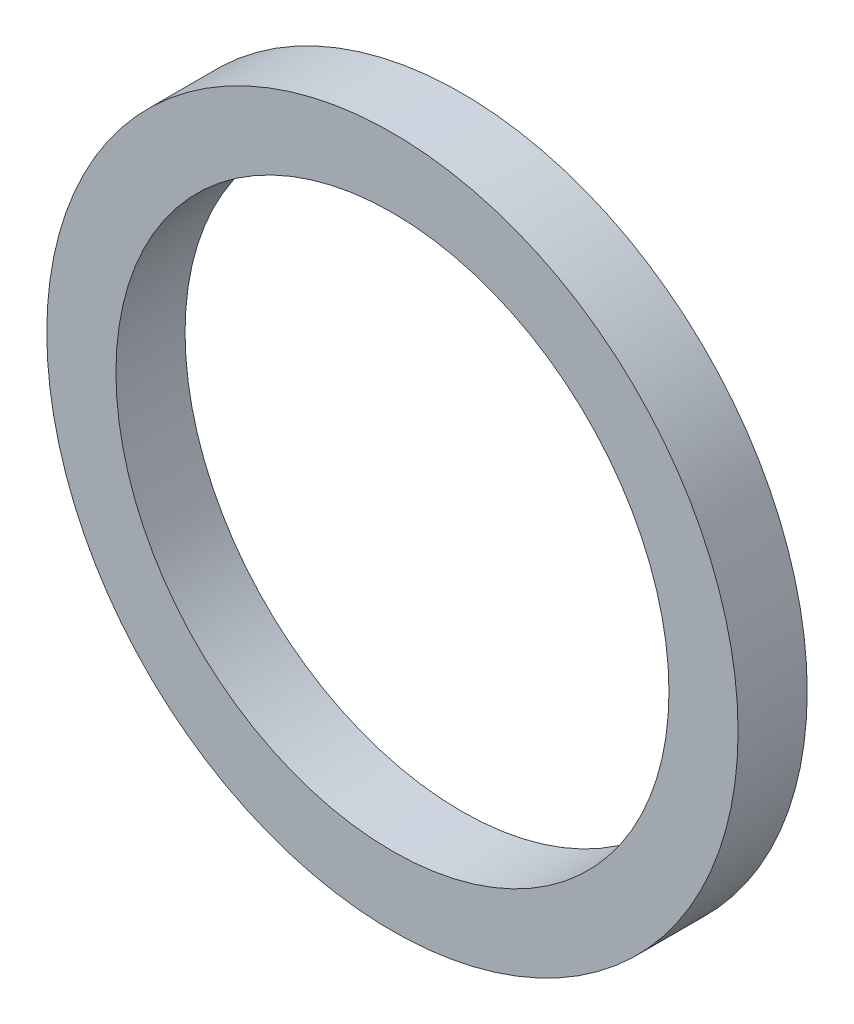
ISO-10303-21;
HEADER;
FILE_DESCRIPTION(('STEP AP214'),'2;1');
FILE_NAME('part.step','',(''),(''),'','','');
FILE_SCHEMA(('AUTOMOTIVE_DESIGN { 1 0 10303 214 1 1 1 1 }'));
ENDSEC;
DATA;
#1=APPLICATION_CONTEXT('core data for automotive mechanical design processes');
#2=APPLICATION_PROTOCOL_DEFINITION('international standard','automotive_design',2000,#1);
#3=PRODUCT_CONTEXT('',#1,'mechanical');
#4=PRODUCT('Part','Part','',(#3));
#5=PRODUCT_RELATED_PRODUCT_CATEGORY('part','',(#4));
#6=PRODUCT_DEFINITION_FORMATION('','',#4);
#7=PRODUCT_DEFINITION_CONTEXT('part definition',#1,'design');
#8=PRODUCT_DEFINITION('design','',#6,#7);
#9=PRODUCT_DEFINITION_SHAPE('','',#8);
#10=(LENGTH_UNIT() NAMED_UNIT(*) SI_UNIT(.MILLI.,.METRE.));
#11=(NAMED_UNIT(*) PLANE_ANGLE_UNIT() SI_UNIT($,.RADIAN.));
#12=(NAMED_UNIT(*) SI_UNIT($,.STERADIAN.) SOLID_ANGLE_UNIT());
#13=UNCERTAINTY_MEASURE_WITH_UNIT(LENGTH_MEASURE(1.E-05),#10,'distance_accuracy_value','');
#14=(GEOMETRIC_REPRESENTATION_CONTEXT(3) GLOBAL_UNCERTAINTY_ASSIGNED_CONTEXT((#13)) GLOBAL_UNIT_ASSIGNED_CONTEXT((#10,
#11,#12)) REPRESENTATION_CONTEXT('',''));
#15=CARTESIAN_POINT('',(0.,0.,0.));
#16=DIRECTION('',(0.,0.,1.));
#17=DIRECTION('',(1.,0.,0.));
#18=AXIS2_PLACEMENT_3D('',#15,#16,#17);
#19=CARTESIAN_POINT('',(0.,0.,15.));
#20=DIRECTION('',(0.,0.,1.));
#21=DIRECTION('',(1.,0.,0.));
#22=AXIS2_PLACEMENT_3D('',#19,#20,#21);
#23=PLANE('',#22);
#24=CARTESIAN_POINT('',(0.,0.,15.));
#25=DIRECTION('',(0.,0.,1.));
#26=DIRECTION('',(1.,0.,0.));
#27=AXIS2_PLACEMENT_3D('',#24,#25,#26);
#28=CIRCLE('',#27,75.);
#29=CARTESIAN_POINT('',(75.,0.,15.));
#30=VERTEX_POINT('',#29);
#31=EDGE_CURVE('E10',#30,#30,#28,.T.);
#32=ORIENTED_EDGE('',*,*,#31,.T.);
#33=EDGE_LOOP('',(#32));
#34=FACE_BOUND('',#33,.T.);
#35=CARTESIAN_POINT('',(0.,0.,15.));
#36=DIRECTION('',(0.,0.,1.));
#37=DIRECTION('',(1.,0.,0.));
#38=AXIS2_PLACEMENT_3D('',#35,#36,#37);
#39=CIRCLE('',#38,60.);
#40=CARTESIAN_POINT('',(60.,0.,15.));
#41=VERTEX_POINT('',#40);
#42=EDGE_CURVE('E48',#41,#41,#39,.T.);
#43=ORIENTED_EDGE('',*,*,#42,.F.);
#44=EDGE_LOOP('',(#43));
#45=FACE_BOUND('',#44,.T.);
#46=ADVANCED_FACE('F37',(#34,#45),#23,.T.);
#47=CARTESIAN_POINT('',(0.,0.,0.));
#48=DIRECTION('',(0.,0.,1.));
#49=DIRECTION('',(1.,0.,0.));
#50=AXIS2_PLACEMENT_3D('',#47,#48,#49);
#51=PLANE('',#50);
#52=CARTESIAN_POINT('',(0.,0.,0.));
#53=DIRECTION('',(0.,0.,1.));
#54=DIRECTION('',(1.,0.,0.));
#55=AXIS2_PLACEMENT_3D('',#52,#53,#54);
#56=CIRCLE('',#55,75.);
#57=CARTESIAN_POINT('',(75.,0.,0.));
#58=VERTEX_POINT('',#57);
#59=EDGE_CURVE('E41',#58,#58,#56,.T.);
#60=ORIENTED_EDGE('',*,*,#59,.F.);
#61=EDGE_LOOP('',(#60));
#62=FACE_BOUND('',#61,.T.);
#63=CARTESIAN_POINT('',(0.,0.,0.));
#64=DIRECTION('',(0.,0.,1.));
#65=DIRECTION('',(1.,0.,0.));
#66=AXIS2_PLACEMENT_3D('',#63,#64,#65);
#67=CIRCLE('',#66,60.);
#68=CARTESIAN_POINT('',(60.,0.,0.));
#69=VERTEX_POINT('',#68);
#70=EDGE_CURVE('E50',#69,#69,#67,.T.);
#71=ORIENTED_EDGE('',*,*,#70,.T.);
#72=EDGE_LOOP('',(#71));
#73=FACE_BOUND('',#72,.T.);
#74=ADVANCED_FACE('F60',(#62,#73),#51,.F.);
#75=CARTESIAN_POINT('',(0.,0.,15.));
#76=DIRECTION('',(0.,0.,-1.));
#77=DIRECTION('',(-1.,0.,0.));
#78=AXIS2_PLACEMENT_3D('',#75,#76,#77);
#79=CYLINDRICAL_SURFACE('',#78,75.);
#80=ORIENTED_EDGE('',*,*,#31,.F.);
#81=EDGE_LOOP('',(#80));
#82=FACE_BOUND('',#81,.T.);
#83=ORIENTED_EDGE('',*,*,#59,.T.);
#84=EDGE_LOOP('',(#83));
#85=FACE_BOUND('',#84,.T.);
#86=ADVANCED_FACE('F39',(#82,#85),#79,.T.);
#87=CARTESIAN_POINT('',(0.,0.,15.));
#88=DIRECTION('',(0.,0.,-1.));
#89=DIRECTION('',(-1.,0.,0.));
#90=AXIS2_PLACEMENT_3D('',#87,#88,#89);
#91=CYLINDRICAL_SURFACE('',#90,60.);
#92=ORIENTED_EDGE('',*,*,#42,.T.);
#93=EDGE_LOOP('',(#92));
#94=FACE_BOUND('',#93,.T.);
#95=ORIENTED_EDGE('',*,*,#70,.F.);
#96=EDGE_LOOP('',(#95));
#97=FACE_BOUND('',#96,.T.);
#98=ADVANCED_FACE('F56',(#94,#97),#91,.F.);
#99=CLOSED_SHELL('',(#46,#74,#86,#98));
#100=MANIFOLD_SOLID_BREP('B2',#99);
#101=ADVANCED_BREP_SHAPE_REPRESENTATION('',(#18,#100),#14);
#102=SHAPE_DEFINITION_REPRESENTATION(#9,#101);
ENDSEC;
END-ISO-10303-21;
